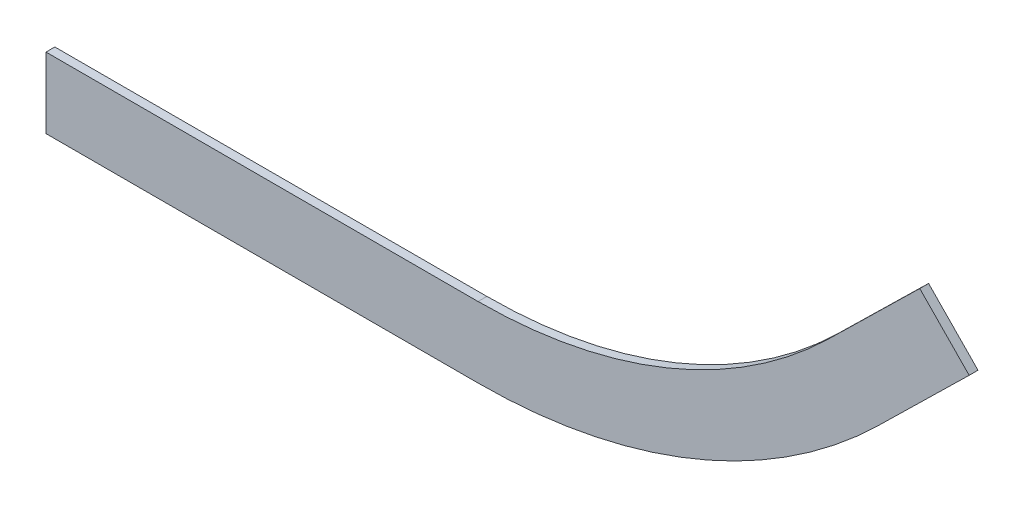
ISO-10303-21;
HEADER;
FILE_DESCRIPTION(('STEP AP214'),'2;1');
FILE_NAME('part.step','',(''),(''),'','','');
FILE_SCHEMA(('AUTOMOTIVE_DESIGN { 1 0 10303 214 1 1 1 1 }'));
ENDSEC;
DATA;
#1=APPLICATION_CONTEXT('core data for automotive mechanical design processes');
#2=APPLICATION_PROTOCOL_DEFINITION('international standard','automotive_design',2000,#1);
#3=PRODUCT_CONTEXT('',#1,'mechanical');
#4=PRODUCT('Part','Part','',(#3));
#5=PRODUCT_RELATED_PRODUCT_CATEGORY('part','',(#4));
#6=PRODUCT_DEFINITION_FORMATION('','',#4);
#7=PRODUCT_DEFINITION_CONTEXT('part definition',#1,'design');
#8=PRODUCT_DEFINITION('design','',#6,#7);
#9=PRODUCT_DEFINITION_SHAPE('','',#8);
#10=(LENGTH_UNIT() NAMED_UNIT(*) SI_UNIT(.MILLI.,.METRE.));
#11=(NAMED_UNIT(*) PLANE_ANGLE_UNIT() SI_UNIT($,.RADIAN.));
#12=(NAMED_UNIT(*) SI_UNIT($,.STERADIAN.) SOLID_ANGLE_UNIT());
#13=UNCERTAINTY_MEASURE_WITH_UNIT(LENGTH_MEASURE(1.E-05),#10,'distance_accuracy_value','');
#14=(GEOMETRIC_REPRESENTATION_CONTEXT(3) GLOBAL_UNCERTAINTY_ASSIGNED_CONTEXT((#13)) GLOBAL_UNIT_ASSIGNED_CONTEXT((#10,
#11,#12)) REPRESENTATION_CONTEXT('',''));
#15=CARTESIAN_POINT('',(0.,0.,0.));
#16=DIRECTION('',(0.,0.,1.));
#17=DIRECTION('',(1.,0.,0.));
#18=AXIS2_PLACEMENT_3D('',#15,#16,#17);
#19=CARTESIAN_POINT('',(494.796861894852,171.441265278339,-2.49999999999995));
#20=DIRECTION('',(0.714607456033303,0.69952568486197,0.));
#21=DIRECTION('',(-0.699525684861971,0.714607456033303,0.));
#22=AXIS2_PLACEMENT_3D('',#19,#20,#21);
#23=PLANE('',#22);
#24=DIRECTION('',(-0.699525684861971,0.714607456033303,0.));
#25=VECTOR('',#24,1.);
#26=CARTESIAN_POINT('',(494.796861894853,171.441265278339,2.50000000000017));
#27=LINE('',#26,#25);
#28=CARTESIAN_POINT('',(522.777889287821,142.856967038549,2.49999999999995));
#29=VERTEX_POINT('',#28);
#30=CARTESIAN_POINT('',(494.796861894853,171.441265278339,2.50000000000017));
#31=VERTEX_POINT('',#30);
#32=EDGE_CURVE('E154',#29,#31,#27,.T.);
#33=ORIENTED_EDGE('',*,*,#32,.F.);
#34=DIRECTION('',(0.,0.,1.));
#35=VECTOR('',#34,1.);
#36=CARTESIAN_POINT('',(522.777889287821,142.856967038549,-2.49999999999972));
#37=LINE('',#36,#35);
#38=CARTESIAN_POINT('',(522.777889287821,142.856967038549,-2.49999999999972));
#39=VERTEX_POINT('',#38);
#40=EDGE_CURVE('E53',#39,#29,#37,.T.);
#41=ORIENTED_EDGE('',*,*,#40,.F.);
#42=DIRECTION('',(-0.699525684861971,0.714607456033303,0.));
#43=VECTOR('',#42,1.);
#44=CARTESIAN_POINT('',(494.796861894852,171.441265278339,-2.49999999999995));
#45=LINE('',#44,#43);
#46=CARTESIAN_POINT('',(494.796861894852,171.441265278339,-2.49999999999995));
#47=VERTEX_POINT('',#46);
#48=EDGE_CURVE('E127',#39,#47,#45,.T.);
#49=ORIENTED_EDGE('',*,*,#48,.T.);
#50=DIRECTION('',(0.,0.,1.));
#51=VECTOR('',#50,1.);
#52=CARTESIAN_POINT('',(494.796861894852,171.441265278339,-2.49999999999995));
#53=LINE('',#52,#51);
#54=EDGE_CURVE('E13',#47,#31,#53,.T.);
#55=ORIENTED_EDGE('',*,*,#54,.T.);
#56=EDGE_LOOP('',(#33,#41,#49,#55));
#57=FACE_BOUND('',#56,.T.);
#58=ADVANCED_FACE('F43',(#57),#23,.T.);
#59=CARTESIAN_POINT('',(487.047516486155,107.880682795451,-2.49999999999972));
#60=DIRECTION('',(0.699525684861971,-0.714607456033304,0.));
#61=DIRECTION('',(0.714607456033305,0.69952568486197,0.));
#62=AXIS2_PLACEMENT_3D('',#59,#60,#61);
#63=PLANE('',#62);
#64=DIRECTION('',(0.714607456033305,0.69952568486197,0.));
#65=VECTOR('',#64,1.);
#66=CARTESIAN_POINT('',(487.047516486156,107.880682795451,2.50000000000006));
#67=LINE('',#66,#65);
#68=CARTESIAN_POINT('',(471.305428265923,92.4708309163473,2.49999999999995));
#69=VERTEX_POINT('',#68);
#70=EDGE_CURVE('E113',#69,#29,#67,.T.);
#71=ORIENTED_EDGE('',*,*,#70,.F.);
#72=DIRECTION('',(0.,0.,1.));
#73=VECTOR('',#72,1.);
#74=CARTESIAN_POINT('',(471.305428265923,92.4708309163475,-2.49999999999995));
#75=LINE('',#74,#73);
#76=CARTESIAN_POINT('',(471.305428265923,92.4708309163475,-2.49999999999995));
#77=VERTEX_POINT('',#76);
#78=EDGE_CURVE('E109',#77,#69,#75,.T.);
#79=ORIENTED_EDGE('',*,*,#78,.F.);
#80=DIRECTION('',(0.714607456033302,0.69952568486197,0.));
#81=VECTOR('',#80,1.);
#82=CARTESIAN_POINT('',(471.305428261894,92.470830920464,-2.49999999999984));
#83=LINE('',#82,#81);
#84=EDGE_CURVE('E112',#77,#39,#83,.T.);
#85=ORIENTED_EDGE('',*,*,#84,.T.);
#86=ORIENTED_EDGE('',*,*,#40,.T.);
#87=EDGE_LOOP('',(#71,#79,#85,#86));
#88=FACE_BOUND('',#87,.T.);
#89=ADVANCED_FACE('F111',(#88),#63,.T.);
#90=CARTESIAN_POINT('',(244.650168028875,324.012777723523,-2.49999999999961));
#91=DIRECTION('',(0.,0.,1.));
#92=DIRECTION('',(0.999999999999999,0.,0.));
#93=AXIS2_PLACEMENT_3D('',#90,#91,#92);
#94=CYLINDRICAL_SURFACE('',#93,324.012777717764);
#95=CARTESIAN_POINT('',(244.650168028875,324.012777723523,2.50000000000017));
#96=DIRECTION('',(0.,0.,1.));
#97=DIRECTION('',(0.999999999999999,0.,0.));
#98=AXIS2_PLACEMENT_3D('',#95,#96,#97);
#99=CIRCLE('',#98,324.012777717764);
#100=CARTESIAN_POINT('',(244.650168028876,-9.15933995315754E-13,2.49999999999995));
#101=VERTEX_POINT('',#100);
#102=EDGE_CURVE('E151',#101,#69,#99,.T.);
#103=ORIENTED_EDGE('',*,*,#102,.F.);
#104=DIRECTION('',(0.,0.,1.));
#105=VECTOR('',#104,1.);
#106=CARTESIAN_POINT('',(244.650168028876,-9.15933995315754E-13,-2.49999999999972));
#107=LINE('',#106,#105);
#108=CARTESIAN_POINT('',(244.650168028876,-9.15933995315754E-13,-2.49999999999972));
#109=VERTEX_POINT('',#108);
#110=EDGE_CURVE('E118',#109,#101,#107,.T.);
#111=ORIENTED_EDGE('',*,*,#110,.F.);
#112=CARTESIAN_POINT('',(244.650168028875,324.012777723523,-2.49999999999961));
#113=DIRECTION('',(0.,0.,1.));
#114=DIRECTION('',(0.999999999999999,0.,0.));
#115=AXIS2_PLACEMENT_3D('',#112,#113,#114);
#116=CIRCLE('',#115,324.012777717764);
#117=EDGE_CURVE('E125',#109,#77,#116,.T.);
#118=ORIENTED_EDGE('',*,*,#117,.T.);
#119=ORIENTED_EDGE('',*,*,#78,.T.);
#120=EDGE_LOOP('',(#103,#111,#118,#119));
#121=FACE_BOUND('',#120,.T.);
#122=ADVANCED_FACE('F130',(#121),#94,.T.);
#123=CARTESIAN_POINT('',(50.0000000000004,-8.88178419700125E-13,-2.49999999999995));
#124=DIRECTION('',(0.,-0.999999999999998,0.));
#125=DIRECTION('',(0.,0.,-1.));
#126=AXIS2_PLACEMENT_3D('',#123,#124,#125);
#127=PLANE('',#126);
#128=DIRECTION('',(0.999999999999999,0.,0.));
#129=VECTOR('',#128,1.);
#130=CARTESIAN_POINT('',(50.0000000000005,-8.04911692853238E-13,2.49999999999995));
#131=LINE('',#130,#129);
#132=CARTESIAN_POINT('',(5.55111512312578E-13,0.,2.50000000000006));
#133=VERTEX_POINT('',#132);
#134=EDGE_CURVE('E148',#133,#101,#131,.T.);
#135=ORIENTED_EDGE('',*,*,#134,.F.);
#136=DIRECTION('',(0.,0.,1.));
#137=VECTOR('',#136,1.);
#138=CARTESIAN_POINT('',(0.,0.,-2.49999999999972));
#139=LINE('',#138,#137);
#140=CARTESIAN_POINT('',(0.,0.,-2.49999999999972));
#141=VERTEX_POINT('',#140);
#142=EDGE_CURVE('E159',#141,#133,#139,.T.);
#143=ORIENTED_EDGE('',*,*,#142,.F.);
#144=DIRECTION('',(1.,0.,0.));
#145=VECTOR('',#144,1.);
#146=CARTESIAN_POINT('',(0.,0.,-2.49999999999972));
#147=LINE('',#146,#145);
#148=EDGE_CURVE('E131',#141,#109,#147,.T.);
#149=ORIENTED_EDGE('',*,*,#148,.T.);
#150=ORIENTED_EDGE('',*,*,#110,.T.);
#151=EDGE_LOOP('',(#135,#143,#149,#150));
#152=FACE_BOUND('',#151,.T.);
#153=ADVANCED_FACE('F185',(#152),#127,.T.);
#154=CARTESIAN_POINT('',(4.44089209850063E-13,39.9999999999999,-2.49999999999995));
#155=DIRECTION('',(-0.999999999999999,0.,0.));
#156=DIRECTION('',(0.,-0.999999999999998,0.));
#157=AXIS2_PLACEMENT_3D('',#154,#155,#156);
#158=PLANE('',#157);
#159=DIRECTION('',(0.,-0.999999999999998,0.));
#160=VECTOR('',#159,1.);
#161=CARTESIAN_POINT('',(1.11022302462516E-13,40.,2.50000000000017));
#162=LINE('',#161,#160);
#163=CARTESIAN_POINT('',(1.11022302462516E-13,40.,2.50000000000017));
#164=VERTEX_POINT('',#163);
#165=EDGE_CURVE('E145',#164,#133,#162,.T.);
#166=ORIENTED_EDGE('',*,*,#165,.F.);
#167=DIRECTION('',(0.,0.,1.));
#168=VECTOR('',#167,1.);
#169=CARTESIAN_POINT('',(4.44089209850063E-13,39.9999999999999,-2.49999999999995));
#170=LINE('',#169,#168);
#171=CARTESIAN_POINT('',(4.44089209850063E-13,39.9999999999999,-2.49999999999995));
#172=VERTEX_POINT('',#171);
#173=EDGE_CURVE('E162',#172,#164,#170,.T.);
#174=ORIENTED_EDGE('',*,*,#173,.F.);
#175=DIRECTION('',(0.,-0.999999999999998,0.));
#176=VECTOR('',#175,1.);
#177=CARTESIAN_POINT('',(4.44089209850063E-13,39.9999999999999,-2.49999999999995));
#178=LINE('',#177,#176);
#179=EDGE_CURVE('E133',#172,#141,#178,.T.);
#180=ORIENTED_EDGE('',*,*,#179,.T.);
#181=ORIENTED_EDGE('',*,*,#142,.T.);
#182=EDGE_LOOP('',(#166,#174,#180,#181));
#183=FACE_BOUND('',#182,.T.);
#184=ADVANCED_FACE('F188',(#183),#158,.T.);
#185=CARTESIAN_POINT('',(4.44089209850063E-13,39.9999999999999,-2.49999999999995));
#186=DIRECTION('',(0.,0.999999999999998,0.));
#187=DIRECTION('',(-0.999999999999999,0.,0.));
#188=AXIS2_PLACEMENT_3D('',#185,#186,#187);
#189=PLANE('',#188);
#190=DIRECTION('',(-0.999999999999999,0.,0.));
#191=VECTOR('',#190,1.);
#192=CARTESIAN_POINT('',(1.11022302462516E-13,40.,2.50000000000017));
#193=LINE('',#192,#191);
#194=CARTESIAN_POINT('',(244.655381072134,39.9999999999962,2.49999999999995));
#195=VERTEX_POINT('',#194);
#196=EDGE_CURVE('E142',#195,#164,#193,.T.);
#197=ORIENTED_EDGE('',*,*,#196,.F.);
#198=DIRECTION('',(0.,0.,1.));
#199=VECTOR('',#198,1.);
#200=CARTESIAN_POINT('',(244.655381072134,39.9999999999964,-2.49999999999972));
#201=LINE('',#200,#199);
#202=CARTESIAN_POINT('',(244.655381072134,39.9999999999964,-2.49999999999972));
#203=VERTEX_POINT('',#202);
#204=EDGE_CURVE('E163',#203,#195,#201,.T.);
#205=ORIENTED_EDGE('',*,*,#204,.F.);
#206=DIRECTION('',(-1.,0.,0.));
#207=VECTOR('',#206,1.);
#208=CARTESIAN_POINT('',(50.0000000000004,39.9999999999988,-2.49999999999972));
#209=LINE('',#208,#207);
#210=EDGE_CURVE('E255',#203,#172,#209,.T.);
#211=ORIENTED_EDGE('',*,*,#210,.T.);
#212=ORIENTED_EDGE('',*,*,#173,.T.);
#213=EDGE_LOOP('',(#197,#205,#211,#212));
#214=FACE_BOUND('',#213,.T.);
#215=ADVANCED_FACE('F192',(#214),#189,.T.);
#216=CARTESIAN_POINT('',(244.655381072138,323.999999999995,-2.49999999999995));
#217=DIRECTION('',(0.,0.,1.));
#218=DIRECTION('',(0.999999999999999,0.,0.));
#219=AXIS2_PLACEMENT_3D('',#216,#217,#218);
#220=CYLINDRICAL_SURFACE('',#219,284.);
#221=CARTESIAN_POINT('',(244.655381072138,323.999999999996,2.49999999999995));
#222=DIRECTION('',(0.,0.,-1.));
#223=DIRECTION('',(0.999999999999999,0.,0.));
#224=AXIS2_PLACEMENT_3D('',#221,#222,#223);
#225=CIRCLE('',#224,284.);
#226=CARTESIAN_POINT('',(443.320675572937,121.051482486538,2.50000000000006));
#227=VERTEX_POINT('',#226);
#228=EDGE_CURVE('E139',#227,#195,#225,.T.);
#229=ORIENTED_EDGE('',*,*,#228,.F.);
#230=DIRECTION('',(0.,0.,1.));
#231=VECTOR('',#230,1.);
#232=CARTESIAN_POINT('',(443.320675572937,121.051482486538,-2.49999999999995));
#233=LINE('',#232,#231);
#234=CARTESIAN_POINT('',(443.320675572937,121.051482486538,-2.49999999999995));
#235=VERTEX_POINT('',#234);
#236=EDGE_CURVE('E47',#235,#227,#233,.T.);
#237=ORIENTED_EDGE('',*,*,#236,.F.);
#238=CARTESIAN_POINT('',(244.655381072138,323.999999999995,-2.49999999999995));
#239=DIRECTION('',(0.,0.,-1.));
#240=DIRECTION('',(0.999999999999999,0.,0.));
#241=AXIS2_PLACEMENT_3D('',#238,#239,#240);
#242=CIRCLE('',#241,284.);
#243=EDGE_CURVE('E256',#235,#203,#242,.T.);
#244=ORIENTED_EDGE('',*,*,#243,.T.);
#245=ORIENTED_EDGE('',*,*,#204,.T.);
#246=EDGE_LOOP('',(#229,#237,#244,#245));
#247=FACE_BOUND('',#246,.T.);
#248=ADVANCED_FACE('F169',(#247),#220,.F.);
#249=CARTESIAN_POINT('',(443.320675572937,121.051482486538,-2.49999999999995));
#250=DIRECTION('',(-0.699525684861968,0.714607456033305,0.));
#251=DIRECTION('',(-0.714607456033306,-0.699525684861968,0.));
#252=AXIS2_PLACEMENT_3D('',#249,#250,#251);
#253=PLANE('',#252);
#254=DIRECTION('',(-0.714607456033306,-0.699525684861968,0.));
#255=VECTOR('',#254,1.);
#256=CARTESIAN_POINT('',(443.320675572937,121.051482486538,2.50000000000006));
#257=LINE('',#256,#255);
#258=EDGE_CURVE('E91',#31,#227,#257,.T.);
#259=ORIENTED_EDGE('',*,*,#258,.F.);
#260=ORIENTED_EDGE('',*,*,#54,.F.);
#261=DIRECTION('',(-0.714607456033303,-0.69952568486197,0.));
#262=VECTOR('',#261,1.);
#263=CARTESIAN_POINT('',(459.066489093187,136.46498103524,-2.49999999999972));
#264=LINE('',#263,#262);
#265=EDGE_CURVE('E94',#47,#235,#264,.T.);
#266=ORIENTED_EDGE('',*,*,#265,.T.);
#267=ORIENTED_EDGE('',*,*,#236,.T.);
#268=EDGE_LOOP('',(#259,#260,#266,#267));
#269=FACE_BOUND('',#268,.T.);
#270=ADVANCED_FACE('F45',(#269),#253,.T.);
#271=CARTESIAN_POINT('',(244.650168028875,324.012777723523,-2.49999999999961));
#272=DIRECTION('',(0.,0.,1.));
#273=DIRECTION('',(0.999999999999999,0.,0.));
#274=AXIS2_PLACEMENT_3D('',#271,#272,#273);
#275=PLANE('',#274);
#276=ORIENTED_EDGE('',*,*,#265,.F.);
#277=ORIENTED_EDGE('',*,*,#48,.F.);
#278=ORIENTED_EDGE('',*,*,#84,.F.);
#279=ORIENTED_EDGE('',*,*,#117,.F.);
#280=ORIENTED_EDGE('',*,*,#148,.F.);
#281=ORIENTED_EDGE('',*,*,#179,.F.);
#282=ORIENTED_EDGE('',*,*,#210,.F.);
#283=ORIENTED_EDGE('',*,*,#243,.F.);
#284=EDGE_LOOP('',(#276,#277,#278,#279,#280,#281,#282,#283));
#285=FACE_BOUND('',#284,.T.);
#286=ADVANCED_FACE('F123',(#285),#275,.F.);
#287=CARTESIAN_POINT('',(244.650168028875,324.012777723523,2.50000000000017));
#288=DIRECTION('',(0.,0.,1.));
#289=DIRECTION('',(0.999999999999999,0.,0.));
#290=AXIS2_PLACEMENT_3D('',#287,#288,#289);
#291=PLANE('',#290);
#292=ORIENTED_EDGE('',*,*,#32,.T.);
#293=ORIENTED_EDGE('',*,*,#258,.T.);
#294=ORIENTED_EDGE('',*,*,#228,.T.);
#295=ORIENTED_EDGE('',*,*,#196,.T.);
#296=ORIENTED_EDGE('',*,*,#165,.T.);
#297=ORIENTED_EDGE('',*,*,#134,.T.);
#298=ORIENTED_EDGE('',*,*,#102,.T.);
#299=ORIENTED_EDGE('',*,*,#70,.T.);
#300=EDGE_LOOP('',(#292,#293,#294,#295,#296,#297,#298,#299));
#301=FACE_BOUND('',#300,.T.);
#302=ADVANCED_FACE('F171',(#301),#291,.T.);
#303=CLOSED_SHELL('',(#58,#89,#122,#153,#184,#215,#248,#270,#286,#302));
#304=MANIFOLD_SOLID_BREP('B2',#303);
#305=ADVANCED_BREP_SHAPE_REPRESENTATION('',(#18,#304),#14);
#306=SHAPE_DEFINITION_REPRESENTATION(#9,#305);
ENDSEC;
END-ISO-10303-21;
